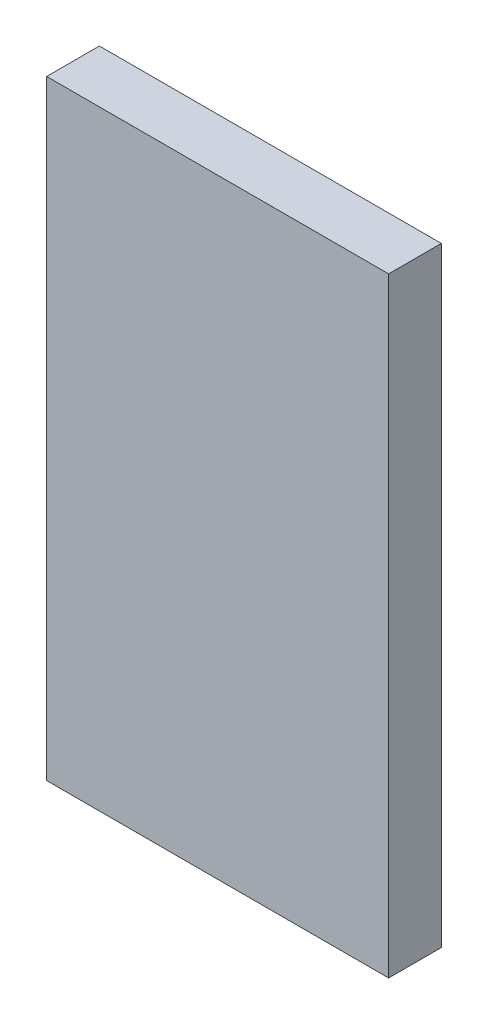
ISO-10303-21;
HEADER;
FILE_DESCRIPTION(('STEP AP214'),'2;1');
FILE_NAME('part.step','',(''),(''),'','','');
FILE_SCHEMA(('AUTOMOTIVE_DESIGN { 1 0 10303 214 1 1 1 1 }'));
ENDSEC;
DATA;
#1=APPLICATION_CONTEXT('core data for automotive mechanical design processes');
#2=APPLICATION_PROTOCOL_DEFINITION('international standard','automotive_design',2000,#1);
#3=PRODUCT_CONTEXT('',#1,'mechanical');
#4=PRODUCT('Part','Part','',(#3));
#5=PRODUCT_RELATED_PRODUCT_CATEGORY('part','',(#4));
#6=PRODUCT_DEFINITION_FORMATION('','',#4);
#7=PRODUCT_DEFINITION_CONTEXT('part definition',#1,'design');
#8=PRODUCT_DEFINITION('design','',#6,#7);
#9=PRODUCT_DEFINITION_SHAPE('','',#8);
#10=(LENGTH_UNIT() NAMED_UNIT(*) SI_UNIT(.MILLI.,.METRE.));
#11=(NAMED_UNIT(*) PLANE_ANGLE_UNIT() SI_UNIT($,.RADIAN.));
#12=(NAMED_UNIT(*) SI_UNIT($,.STERADIAN.) SOLID_ANGLE_UNIT());
#13=UNCERTAINTY_MEASURE_WITH_UNIT(LENGTH_MEASURE(1.E-05),#10,'distance_accuracy_value','');
#14=(GEOMETRIC_REPRESENTATION_CONTEXT(3) GLOBAL_UNCERTAINTY_ASSIGNED_CONTEXT((#13)) GLOBAL_UNIT_ASSIGNED_CONTEXT((#10,
#11,#12)) REPRESENTATION_CONTEXT('',''));
#15=CARTESIAN_POINT('',(0.,0.,0.));
#16=DIRECTION('',(0.,0.,1.));
#17=DIRECTION('',(1.,0.,0.));
#18=AXIS2_PLACEMENT_3D('',#15,#16,#17);
#19=CARTESIAN_POINT('',(30.,53.5,0.));
#20=DIRECTION('',(0.,1.,0.));
#21=DIRECTION('',(0.,0.,1.));
#22=AXIS2_PLACEMENT_3D('',#19,#20,#21);
#23=PLANE('',#22);
#24=DIRECTION('',(-1.,0.,0.));
#25=VECTOR('',#24,1.);
#26=CARTESIAN_POINT('',(30.,53.5,9.25));
#27=LINE('',#26,#25);
#28=CARTESIAN_POINT('',(30.,53.5,9.25));
#29=VERTEX_POINT('',#28);
#30=CARTESIAN_POINT('',(-30.,53.5,9.25));
#31=VERTEX_POINT('',#30);
#32=EDGE_CURVE('E103',#29,#31,#27,.T.);
#33=ORIENTED_EDGE('',*,*,#32,.F.);
#34=DIRECTION('',(0.,0.,1.));
#35=VECTOR('',#34,1.);
#36=CARTESIAN_POINT('',(30.,53.5,0.));
#37=LINE('',#36,#35);
#38=CARTESIAN_POINT('',(30.,53.5,0.));
#39=VERTEX_POINT('',#38);
#40=EDGE_CURVE('E11',#39,#29,#37,.T.);
#41=ORIENTED_EDGE('',*,*,#40,.F.);
#42=DIRECTION('',(-1.,0.,0.));
#43=VECTOR('',#42,1.);
#44=CARTESIAN_POINT('',(30.,53.5,0.));
#45=LINE('',#44,#43);
#46=CARTESIAN_POINT('',(-30.,53.5,0.));
#47=VERTEX_POINT('',#46);
#48=EDGE_CURVE('E97',#39,#47,#45,.T.);
#49=ORIENTED_EDGE('',*,*,#48,.T.);
#50=DIRECTION('',(0.,0.,1.));
#51=VECTOR('',#50,1.);
#52=CARTESIAN_POINT('',(-30.,53.5,0.));
#53=LINE('',#52,#51);
#54=EDGE_CURVE('E42',#47,#31,#53,.T.);
#55=ORIENTED_EDGE('',*,*,#54,.T.);
#56=EDGE_LOOP('',(#33,#41,#49,#55));
#57=FACE_BOUND('',#56,.T.);
#58=ADVANCED_FACE('F39',(#57),#23,.T.);
#59=CARTESIAN_POINT('',(30.,-53.5,0.));
#60=DIRECTION('',(1.,0.,0.));
#61=DIRECTION('',(0.,0.,-1.));
#62=AXIS2_PLACEMENT_3D('',#59,#60,#61);
#63=PLANE('',#62);
#64=DIRECTION('',(0.,1.,0.));
#65=VECTOR('',#64,1.);
#66=CARTESIAN_POINT('',(30.,-53.5,9.25));
#67=LINE('',#66,#65);
#68=CARTESIAN_POINT('',(30.,-53.5,9.25));
#69=VERTEX_POINT('',#68);
#70=EDGE_CURVE('E99',#69,#29,#67,.T.);
#71=ORIENTED_EDGE('',*,*,#70,.F.);
#72=DIRECTION('',(0.,0.,1.));
#73=VECTOR('',#72,1.);
#74=CARTESIAN_POINT('',(30.,-53.5,0.));
#75=LINE('',#74,#73);
#76=CARTESIAN_POINT('',(30.,-53.5,0.));
#77=VERTEX_POINT('',#76);
#78=EDGE_CURVE('E48',#77,#69,#75,.T.);
#79=ORIENTED_EDGE('',*,*,#78,.F.);
#80=DIRECTION('',(0.,1.,0.));
#81=VECTOR('',#80,1.);
#82=CARTESIAN_POINT('',(30.,-53.5,0.));
#83=LINE('',#82,#81);
#84=EDGE_CURVE('E94',#77,#39,#83,.T.);
#85=ORIENTED_EDGE('',*,*,#84,.T.);
#86=ORIENTED_EDGE('',*,*,#40,.T.);
#87=EDGE_LOOP('',(#71,#79,#85,#86));
#88=FACE_BOUND('',#87,.T.);
#89=ADVANCED_FACE('F113',(#88),#63,.T.);
#90=CARTESIAN_POINT('',(-30.,-53.5,0.));
#91=DIRECTION('',(0.,-1.,0.));
#92=DIRECTION('',(0.,0.,-1.));
#93=AXIS2_PLACEMENT_3D('',#90,#91,#92);
#94=PLANE('',#93);
#95=DIRECTION('',(1.,0.,0.));
#96=VECTOR('',#95,1.);
#97=CARTESIAN_POINT('',(-30.,-53.5,9.25));
#98=LINE('',#97,#96);
#99=CARTESIAN_POINT('',(-30.,-53.5,9.25));
#100=VERTEX_POINT('',#99);
#101=EDGE_CURVE('E89',#100,#69,#98,.T.);
#102=ORIENTED_EDGE('',*,*,#101,.F.);
#103=DIRECTION('',(0.,0.,1.));
#104=VECTOR('',#103,1.);
#105=CARTESIAN_POINT('',(-30.,-53.5,0.));
#106=LINE('',#105,#104);
#107=CARTESIAN_POINT('',(-30.,-53.5,0.));
#108=VERTEX_POINT('',#107);
#109=EDGE_CURVE('E84',#108,#100,#106,.T.);
#110=ORIENTED_EDGE('',*,*,#109,.F.);
#111=DIRECTION('',(1.,0.,0.));
#112=VECTOR('',#111,1.);
#113=CARTESIAN_POINT('',(-30.,-53.5,0.));
#114=LINE('',#113,#112);
#115=EDGE_CURVE('E87',#108,#77,#114,.T.);
#116=ORIENTED_EDGE('',*,*,#115,.T.);
#117=ORIENTED_EDGE('',*,*,#78,.T.);
#118=EDGE_LOOP('',(#102,#110,#116,#117));
#119=FACE_BOUND('',#118,.T.);
#120=ADVANCED_FACE('F86',(#119),#94,.T.);
#121=CARTESIAN_POINT('',(-30.,53.5,0.));
#122=DIRECTION('',(-1.,0.,0.));
#123=DIRECTION('',(0.,0.,1.));
#124=AXIS2_PLACEMENT_3D('',#121,#122,#123);
#125=PLANE('',#124);
#126=DIRECTION('',(0.,-1.,0.));
#127=VECTOR('',#126,1.);
#128=CARTESIAN_POINT('',(-30.,53.5,9.25));
#129=LINE('',#128,#127);
#130=EDGE_CURVE('E106',#31,#100,#129,.T.);
#131=ORIENTED_EDGE('',*,*,#130,.F.);
#132=ORIENTED_EDGE('',*,*,#54,.F.);
#133=DIRECTION('',(0.,-1.,0.));
#134=VECTOR('',#133,1.);
#135=CARTESIAN_POINT('',(-30.,53.5,0.));
#136=LINE('',#135,#134);
#137=EDGE_CURVE('E93',#47,#108,#136,.T.);
#138=ORIENTED_EDGE('',*,*,#137,.T.);
#139=ORIENTED_EDGE('',*,*,#109,.T.);
#140=EDGE_LOOP('',(#131,#132,#138,#139));
#141=FACE_BOUND('',#140,.T.);
#142=ADVANCED_FACE('F96',(#141),#125,.T.);
#143=CARTESIAN_POINT('',(0.,0.,0.));
#144=DIRECTION('',(0.,0.,1.));
#145=DIRECTION('',(1.,0.,0.));
#146=AXIS2_PLACEMENT_3D('',#143,#144,#145);
#147=PLANE('',#146);
#148=ORIENTED_EDGE('',*,*,#48,.F.);
#149=ORIENTED_EDGE('',*,*,#84,.F.);
#150=ORIENTED_EDGE('',*,*,#115,.F.);
#151=ORIENTED_EDGE('',*,*,#137,.F.);
#152=EDGE_LOOP('',(#148,#149,#150,#151));
#153=FACE_BOUND('',#152,.T.);
#154=ADVANCED_FACE('F92',(#153),#147,.F.);
#155=CARTESIAN_POINT('',(0.,0.,9.25));
#156=DIRECTION('',(0.,0.,1.));
#157=DIRECTION('',(1.,0.,0.));
#158=AXIS2_PLACEMENT_3D('',#155,#156,#157);
#159=PLANE('',#158);
#160=ORIENTED_EDGE('',*,*,#32,.T.);
#161=ORIENTED_EDGE('',*,*,#130,.T.);
#162=ORIENTED_EDGE('',*,*,#101,.T.);
#163=ORIENTED_EDGE('',*,*,#70,.T.);
#164=EDGE_LOOP('',(#160,#161,#162,#163));
#165=FACE_BOUND('',#164,.T.);
#166=ADVANCED_FACE('F112',(#165),#159,.T.);
#167=CLOSED_SHELL('',(#58,#89,#120,#142,#154,#166));
#168=MANIFOLD_SOLID_BREP('B2',#167);
#169=ADVANCED_BREP_SHAPE_REPRESENTATION('',(#18,#168),#14);
#170=SHAPE_DEFINITION_REPRESENTATION(#9,#169);
ENDSEC;
END-ISO-10303-21;
